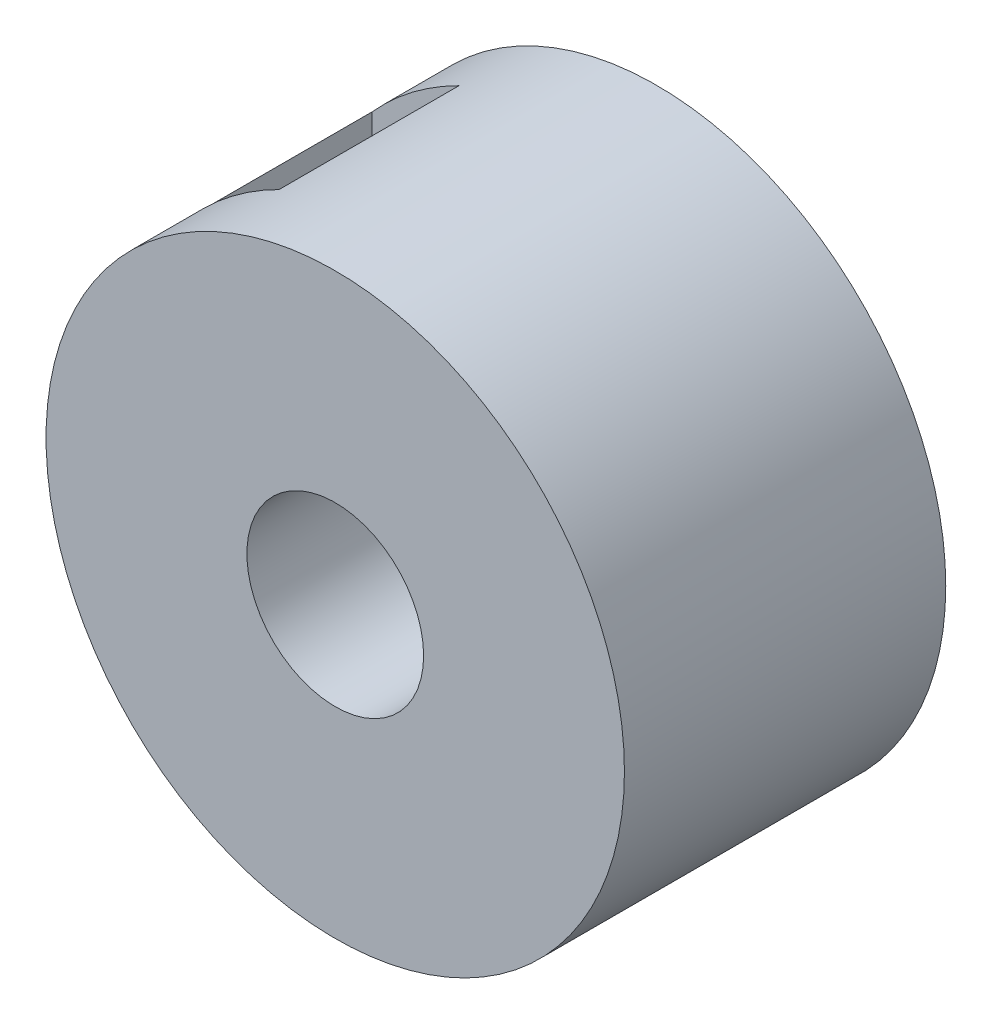
ISO-10303-21;
HEADER;
FILE_DESCRIPTION(('STEP AP214'),'2;1');
FILE_NAME('part.step','',(''),(''),'','','');
FILE_SCHEMA(('AUTOMOTIVE_DESIGN { 1 0 10303 214 1 1 1 1 }'));
ENDSEC;
DATA;
#1=APPLICATION_CONTEXT('core data for automotive mechanical design processes');
#2=APPLICATION_PROTOCOL_DEFINITION('international standard','automotive_design',2000,#1);
#3=PRODUCT_CONTEXT('',#1,'mechanical');
#4=PRODUCT('Part','Part','',(#3));
#5=PRODUCT_RELATED_PRODUCT_CATEGORY('part','',(#4));
#6=PRODUCT_DEFINITION_FORMATION('','',#4);
#7=PRODUCT_DEFINITION_CONTEXT('part definition',#1,'design');
#8=PRODUCT_DEFINITION('design','',#6,#7);
#9=PRODUCT_DEFINITION_SHAPE('','',#8);
#10=(LENGTH_UNIT() NAMED_UNIT(*) SI_UNIT(.MILLI.,.METRE.));
#11=(NAMED_UNIT(*) PLANE_ANGLE_UNIT() SI_UNIT($,.RADIAN.));
#12=(NAMED_UNIT(*) SI_UNIT($,.STERADIAN.) SOLID_ANGLE_UNIT());
#13=UNCERTAINTY_MEASURE_WITH_UNIT(LENGTH_MEASURE(1.E-05),#10,'distance_accuracy_value','');
#14=(GEOMETRIC_REPRESENTATION_CONTEXT(3) GLOBAL_UNCERTAINTY_ASSIGNED_CONTEXT((#13)) GLOBAL_UNIT_ASSIGNED_CONTEXT((#10,
#11,#12)) REPRESENTATION_CONTEXT('',''));
#15=CARTESIAN_POINT('',(0.,0.,0.));
#16=DIRECTION('',(0.,0.,1.));
#17=DIRECTION('',(1.,0.,0.));
#18=AXIS2_PLACEMENT_3D('',#15,#16,#17);
#19=CARTESIAN_POINT('',(-12.5233996659517,0.,9.99999966472387));
#20=DIRECTION('',(1.,0.,0.));
#21=DIRECTION('',(0.,0.,-1.));
#22=AXIS2_PLACEMENT_3D('',#19,#20,#21);
#23=CYLINDRICAL_SURFACE('',#22,1.6);
#24=CARTESIAN_POINT('',(-6.7,0.,9.99999966472387));
#25=DIRECTION('',(1.,0.,0.));
#26=DIRECTION('',(0.,0.,-1.));
#27=AXIS2_PLACEMENT_3D('',#24,#25,#26);
#28=CIRCLE('',#27,1.6);
#29=CARTESIAN_POINT('',(-6.7,0.,8.39999966472387));
#30=VERTEX_POINT('',#29);
#31=EDGE_CURVE('E99',#30,#30,#28,.T.);
#32=CARTESIAN_POINT('',(-8.55,0.,9.99999966472387));
#33=DIRECTION('',(-1.,0.,0.));
#34=DIRECTION('',(0.,0.,1.));
#35=AXIS2_PLACEMENT_3D('',#32,#33,#34);
#36=CIRCLE('',#35,1.6);
#37=CARTESIAN_POINT('',(-8.55,0.,8.39999966472387));
#38=VERTEX_POINT('',#37);
#39=EDGE_CURVE('E134',#38,#38,#36,.F.);
#40=CARTESIAN_POINT('',(-6.7,0.,8.39999966472387));
#41=CARTESIAN_POINT('',(-6.71927083333333,0.,8.39999966472387));
#42=CARTESIAN_POINT('',(-6.73854166666667,0.,8.39999966472387));
#43=CARTESIAN_POINT('',(-6.77708333333333,0.,8.39999966472387));
#44=CARTESIAN_POINT('',(-6.79635416666667,0.,8.39999966472387));
#45=CARTESIAN_POINT('',(-6.83489583333333,0.,8.39999966472387));
#46=CARTESIAN_POINT('',(-6.85416666666667,0.,8.39999966472387));
#47=CARTESIAN_POINT('',(-6.89270833333333,0.,8.39999966472387));
#48=CARTESIAN_POINT('',(-6.91197916666667,0.,8.39999966472387));
#49=CARTESIAN_POINT('',(-6.95052083333333,0.,8.39999966472387));
#50=CARTESIAN_POINT('',(-6.96979166666667,0.,8.39999966472387));
#51=CARTESIAN_POINT('',(-7.00833333333333,0.,8.39999966472387));
#52=CARTESIAN_POINT('',(-7.02760416666667,0.,8.39999966472387));
#53=CARTESIAN_POINT('',(-7.06614583333333,0.,8.39999966472387));
#54=CARTESIAN_POINT('',(-7.08541666666667,0.,8.39999966472387));
#55=CARTESIAN_POINT('',(-7.12395833333333,0.,8.39999966472387));
#56=CARTESIAN_POINT('',(-7.14322916666667,0.,8.39999966472387));
#57=CARTESIAN_POINT('',(-7.18177083333333,0.,8.39999966472387));
#58=CARTESIAN_POINT('',(-7.20104166666667,0.,8.39999966472387));
#59=CARTESIAN_POINT('',(-7.23958333333333,0.,8.39999966472387));
#60=CARTESIAN_POINT('',(-7.25885416666667,0.,8.39999966472387));
#61=CARTESIAN_POINT('',(-7.29739583333333,0.,8.39999966472387));
#62=CARTESIAN_POINT('',(-7.31666666666667,0.,8.39999966472387));
#63=CARTESIAN_POINT('',(-7.35520833333333,0.,8.39999966472387));
#64=CARTESIAN_POINT('',(-7.37447916666667,0.,8.39999966472387));
#65=CARTESIAN_POINT('',(-7.41302083333333,0.,8.39999966472387));
#66=CARTESIAN_POINT('',(-7.43229166666667,0.,8.39999966472387));
#67=CARTESIAN_POINT('',(-7.47083333333333,0.,8.39999966472387));
#68=CARTESIAN_POINT('',(-7.49010416666667,0.,8.39999966472387));
#69=CARTESIAN_POINT('',(-7.52864583333333,0.,8.39999966472387));
#70=CARTESIAN_POINT('',(-7.54791666666667,0.,8.39999966472387));
#71=CARTESIAN_POINT('',(-7.58645833333333,0.,8.39999966472387));
#72=CARTESIAN_POINT('',(-7.60572916666667,0.,8.39999966472387));
#73=CARTESIAN_POINT('',(-7.64427083333333,0.,8.39999966472387));
#74=CARTESIAN_POINT('',(-7.66354166666667,0.,8.39999966472387));
#75=CARTESIAN_POINT('',(-7.70208333333333,0.,8.39999966472387));
#76=CARTESIAN_POINT('',(-7.72135416666667,0.,8.39999966472387));
#77=CARTESIAN_POINT('',(-7.75989583333333,0.,8.39999966472387));
#78=CARTESIAN_POINT('',(-7.77916666666667,0.,8.39999966472387));
#79=CARTESIAN_POINT('',(-7.81770833333333,0.,8.39999966472387));
#80=CARTESIAN_POINT('',(-7.83697916666667,0.,8.39999966472387));
#81=CARTESIAN_POINT('',(-7.87552083333333,0.,8.39999966472387));
#82=CARTESIAN_POINT('',(-7.89479166666667,0.,8.39999966472387));
#83=CARTESIAN_POINT('',(-7.93333333333333,0.,8.39999966472387));
#84=CARTESIAN_POINT('',(-7.95260416666667,0.,8.39999966472387));
#85=CARTESIAN_POINT('',(-7.99114583333333,0.,8.39999966472387));
#86=CARTESIAN_POINT('',(-8.01041666666667,0.,8.39999966472387));
#87=CARTESIAN_POINT('',(-8.04895833333333,0.,8.39999966472387));
#88=CARTESIAN_POINT('',(-8.06822916666667,0.,8.39999966472387));
#89=CARTESIAN_POINT('',(-8.10677083333333,0.,8.39999966472387));
#90=CARTESIAN_POINT('',(-8.12604166666667,0.,8.39999966472387));
#91=CARTESIAN_POINT('',(-8.16458333333333,0.,8.39999966472387));
#92=CARTESIAN_POINT('',(-8.18385416666667,0.,8.39999966472387));
#93=CARTESIAN_POINT('',(-8.22239583333333,0.,8.39999966472387));
#94=CARTESIAN_POINT('',(-8.24166666666667,0.,8.39999966472387));
#95=CARTESIAN_POINT('',(-8.28020833333333,0.,8.39999966472387));
#96=CARTESIAN_POINT('',(-8.29947916666666,0.,8.39999966472387));
#97=CARTESIAN_POINT('',(-8.33802083333333,0.,8.39999966472387));
#98=CARTESIAN_POINT('',(-8.35729166666666,0.,8.39999966472387));
#99=CARTESIAN_POINT('',(-8.39583333333333,0.,8.39999966472387));
#100=CARTESIAN_POINT('',(-8.41510416666666,0.,8.39999966472387));
#101=CARTESIAN_POINT('',(-8.45364583333333,0.,8.39999966472387));
#102=CARTESIAN_POINT('',(-8.47291666666666,0.,8.39999966472387));
#103=CARTESIAN_POINT('',(-8.51145833333333,0.,8.39999966472387));
#104=CARTESIAN_POINT('',(-8.53072916666667,0.,8.39999966472387));
#105=CARTESIAN_POINT('',(-8.55,0.,8.39999966472387));
#106=B_SPLINE_CURVE_WITH_KNOTS('',3,(#40,#41,#42,#43,#44,#45,#46,#47,#48,#49,#50,#51,#52,#53,
#54,#55,#56,#57,#58,#59,#60,#61,#62,#63,#64,#65,#66,#67,#68,#69,#70,#71,#72,#73,#74,#75,#76,#77,
#78,#79,#80,#81,#82,#83,#84,#85,#86,#87,#88,#89,#90,#91,#92,#93,#94,#95,#96,#97,#98,#99,#100,
#101,#102,#103,#104,#105),.UNSPECIFIED.,.F.,.F.,(4,2,2,2,2,2,2,2,2,2,2,2,2,2,2,2,2,2,2,2,2,2,2,
2,2,2,2,2,2,2,2,2,4),(0.,0.0578124999999997,0.115624999999999,0.1734375,0.23125,
0.289062499999999,0.346875,0.4046875,0.462499999999999,0.520312499999999,0.578124999999999,
0.635937499999999,0.693749999999999,0.751562499999999,0.809374999999999,0.867187499999999,
0.924999999999999,0.982812499999998,1.040625,1.0984375,1.15625,1.2140625,1.271875,1.3296875,
1.3875,1.4453125,1.503125,1.5609375,1.61875,1.6765625,1.734375,1.7921875,1.85),.UNSPECIFIED.);
#107=EDGE_CURVE('BSEAM34',#30,#38,#106,.T.);
#108=ORIENTED_EDGE('',*,*,#31,.T.);
#109=ORIENTED_EDGE('',*,*,#39,.F.);
#110=ORIENTED_EDGE('',*,*,#107,.T.);
#111=ORIENTED_EDGE('',*,*,#107,.F.);
#112=EDGE_LOOP('',(#108,#110,#109,#111));
#113=FACE_BOUND('',#112,.T.);
#114=ADVANCED_FACE('F34',(#113),#23,.F.);
#115=CARTESIAN_POINT('',(0.,0.,-20.4558442344744));
#116=DIRECTION('',(0.,0.,1.));
#117=DIRECTION('',(1.,0.,0.));
#118=AXIS2_PLACEMENT_3D('',#115,#116,#117);
#119=CYLINDRICAL_SURFACE('',#118,9.);
#120=CARTESIAN_POINT('',(-9.,0.,12.7499996647239));
#121=CARTESIAN_POINT('',(-8.99999893245936,0.150732094383244,12.7499981983165));
#122=CARTESIAN_POINT('',(-8.99617730706269,0.301479092927,12.7375658692782));
#123=CARTESIAN_POINT('',(-8.98130590481736,0.598575006536847,12.688288473409));
#124=CARTESIAN_POINT('',(-8.97025420178754,0.744922738714214,12.6514369009592));
#125=CARTESIAN_POINT('',(-8.94213200467288,1.02889246681853,12.5546722671474));
#126=CARTESIAN_POINT('',(-8.92507058656823,1.16652725345855,12.4947939687202));
#127=CARTESIAN_POINT('',(-8.88669712370446,1.42980304986473,12.3538205196455));
#128=CARTESIAN_POINT('',(-8.86538446701522,1.5554423291241,12.2727223140459));
#129=CARTESIAN_POINT('',(-8.82006981807301,1.7948886815975,12.0890768650394));
#130=CARTESIAN_POINT('',(-8.79601116938576,1.90828973267437,11.9860142524148));
#131=CARTESIAN_POINT('',(-8.74824972808289,2.11649716491155,11.7624634924739));
#132=CARTESIAN_POINT('',(-8.72454699877658,2.21130027330405,11.6419722846351));
#133=CARTESIAN_POINT('',(-8.6795779558473,2.38178581823689,11.3835142152972));
#134=CARTESIAN_POINT('',(-8.658381838066,2.45696755854626,11.2452037158203));
#135=CARTESIAN_POINT('',(-8.62167505843869,2.58283736596423,10.9571503377272));
#136=CARTESIAN_POINT('',(-8.60616297362894,2.63353156439558,10.8074103317774));
#137=CARTESIAN_POINT('',(-8.58317198413569,2.70751366305417,10.5053177726362));
#138=CARTESIAN_POINT('',(-8.575473616912,2.73155215494405,10.3531661963228));
#139=CARTESIAN_POINT('',(-8.56832938547418,2.75388480203957,10.0468098790786));
#140=CARTESIAN_POINT('',(-8.56888143701378,2.75218545921505,9.89260566652552));
#141=CARTESIAN_POINT('',(-8.57798150913322,2.7236791338439,9.59267111233976));
#142=CARTESIAN_POINT('',(-8.58622811981501,2.69781854133944,9.44684015352559));
#143=CARTESIAN_POINT('',(-8.60929961263038,2.62325522727671,9.16169449786718));
#144=CARTESIAN_POINT('',(-8.62412516588299,2.57455017532244,9.02238046741901));
#145=CARTESIAN_POINT('',(-8.65892040636349,2.45499611619024,8.7519350245088));
#146=CARTESIAN_POINT('',(-8.67895969673658,2.38384448176113,8.62094673094464));
#147=CARTESIAN_POINT('',(-8.7218917222245,2.22162725198069,8.37245483434441));
#148=CARTESIAN_POINT('',(-8.74478517030468,2.13055667659752,8.25495461474989));
#149=CARTESIAN_POINT('',(-8.79206258069755,1.92641124977821,8.03141413099756));
#150=CARTESIAN_POINT('',(-8.8164681053405,1.81255281332942,7.92609275706142));
#151=CARTESIAN_POINT('',(-8.86314096649346,1.56848594209703,7.73586819837682));
#152=CARTESIAN_POINT('',(-8.88540815813406,1.43827640092345,7.65096639644367));
#153=CARTESIAN_POINT('',(-8.92551194390399,1.1638622812981,7.5035324033556));
#154=CARTESIAN_POINT('',(-8.94331562734555,1.01956405600497,7.44116495992596));
#155=CARTESIAN_POINT('',(-8.9722490818792,0.721855243529071,7.34179892464794));
#156=CARTESIAN_POINT('',(-8.98338078675626,0.56844731085653,7.30479298165677));
#157=CARTESIAN_POINT('',(-8.99740784277959,0.2629811141946,7.25840944691507));
#158=CARTESIAN_POINT('',(-9.00059336328466,0.11108382469676,7.24805803916311));
#159=CARTESIAN_POINT('',(-8.99922345680051,-0.192290019314816,7.25254081788383));
#160=CARTESIAN_POINT('',(-8.99466910577635,-0.343766629377612,7.26737150364536));
#161=CARTESIAN_POINT('',(-8.97852146739649,-0.638288264909713,7.32101249992359));
#162=CARTESIAN_POINT('',(-8.96709666869246,-0.781447879799152,7.35924919882028));
#163=CARTESIAN_POINT('',(-8.93853661982543,-1.05928473094201,7.45792238337304));
#164=CARTESIAN_POINT('',(-8.92140067443833,-1.19396093212591,7.51836157185393));
#165=CARTESIAN_POINT('',(-8.88268238228463,-1.45455502141013,7.66132910722377));
#166=CARTESIAN_POINT('',(-8.86100429812044,-1.58018976298334,7.74434692795634));
#167=CARTESIAN_POINT('',(-8.81568626913578,-1.81607444992139,7.9295237161647));
#168=CARTESIAN_POINT('',(-8.79204581555462,-1.92632038561877,8.03168765612038));
#169=CARTESIAN_POINT('',(-8.7443462936598,-2.13261647839858,8.25683446134768));
#170=CARTESIAN_POINT('',(-8.72030513809504,-2.22797320358393,8.38045790350791));
#171=CARTESIAN_POINT('',(-8.67546813822459,-2.3966426855674,8.64247443340888));
#172=CARTESIAN_POINT('',(-8.65467222259465,-2.46995592687254,8.78086719643522));
#173=CARTESIAN_POINT('',(-8.61891634694994,-2.59197431563521,9.06811777522072));
#174=CARTESIAN_POINT('',(-8.60393114735008,-2.64078616671214,9.2169269398796));
#175=CARTESIAN_POINT('',(-8.58159540779338,-2.71250039411907,9.52119957061985));
#176=CARTESIAN_POINT('',(-8.57424212601462,-2.7354120755372,9.67666062604723));
#177=CARTESIAN_POINT('',(-8.56827980578256,-2.75402711718725,9.98260055606583));
#178=CARTESIAN_POINT('',(-8.56930645948381,-2.75086398785782,10.1330042417674));
#179=CARTESIAN_POINT('',(-8.57910842739003,-2.72013837625648,10.431028005173));
#180=CARTESIAN_POINT('',(-8.58788340928386,-2.69257694038167,10.5786482019782));
#181=CARTESIAN_POINT('',(-8.61194440210273,-2.61458088665956,10.8649852574071));
#182=CARTESIAN_POINT('',(-8.62714178162794,-2.5644570462885,11.0037947731395));
#183=CARTESIAN_POINT('',(-8.66231608002941,-2.44300207573848,11.2711448072469));
#184=CARTESIAN_POINT('',(-8.68229393943823,-2.37166677165226,11.399683298209));
#185=CARTESIAN_POINT('',(-8.72571614166417,-2.20667281830586,11.6480753519819));
#186=CARTESIAN_POINT('',(-8.74926262367163,-2.11227528824507,11.7674202340936));
#187=CARTESIAN_POINT('',(-8.79668470464009,-1.90515328521005,11.9889427174175));
#188=CARTESIAN_POINT('',(-8.82056038861478,-1.79242399389637,12.0911157907768));
#189=CARTESIAN_POINT('',(-8.86683031610179,-1.547669239036,12.2785286654089));
#190=CARTESIAN_POINT('',(-8.88915651654838,-1.41515737636223,12.3631518437793));
#191=CARTESIAN_POINT('',(-8.92897904862101,-1.13710535194912,12.508803456823));
#192=CARTESIAN_POINT('',(-8.94647748145661,-0.991570894729586,12.5698421609133));
#193=CARTESIAN_POINT('',(-8.97328009657381,-0.706221718726763,12.6615750248649));
#194=CARTESIAN_POINT('',(-8.9832154245542,-0.567225966118484,12.6946419401547));
#195=CARTESIAN_POINT('',(-8.99657528918104,-0.285490807433529,12.7388529590984));
#196=CARTESIAN_POINT('',(-9.00000101102327,-0.142752087632907,12.7500010534972));
#197=CARTESIAN_POINT('',(-9.,0.,12.7499996647239));
#198=B_SPLINE_CURVE_WITH_KNOTS('',3,(#120,#121,#122,#123,#124,#125,#126,#127,#128,#129,#130,
#131,#132,#133,#134,#135,#136,#137,#138,#139,#140,#141,#142,#143,#144,#145,#146,#147,#148,#149,
#150,#151,#152,#153,#154,#155,#156,#157,#158,#159,#160,#161,#162,#163,#164,#165,#166,#167,#168,
#169,#170,#171,#172,#173,#174,#175,#176,#177,#178,#179,#180,#181,#182,#183,#184,#185,#186,#187,
#188,#189,#190,#191,#192,#193,#194,#195,#196,#197),.UNSPECIFIED.,.T.,.F.,(4,2,2,2,2,2,2,2,2,2,2,
2,2,2,2,2,2,2,2,2,2,2,2,2,2,2,2,2,2,2,2,2,2,2,2,2,2,2,4),(0.,0.451671768738212,
0.903463917390862,1.3545766662571,1.80575439593737,2.26899159301454,2.73231023514845,
3.20649731690051,3.68056560751205,4.14091608625177,4.60115027179782,5.04408074028462,
5.48705640257287,5.93627973927626,6.38561551714736,6.85445681262312,7.3233298491407,
7.79556456434792,8.26766234228229,8.72225023467786,9.17677493730695,9.62058331100847,
10.0644457297312,10.518825583913,10.973323610017,11.444987693106,11.9166414084481,
12.3862228519221,12.8556355363944,13.3047534112771,13.7538520252794,14.1969455015462,
14.6401262257455,15.0999803202335,15.5599554792002,16.0340612766837,16.5079604004188,
16.9357978208538,17.3635573380027),.UNSPECIFIED.);
#199=CARTESIAN_POINT('',(-9.,0.,12.7499996647239));
#200=VERTEX_POINT('',#199);
#201=EDGE_CURVE('E12',#200,#200,#198,.T.);
#202=ORIENTED_EDGE('',*,*,#201,.F.);
#203=EDGE_LOOP('',(#202));
#204=FACE_BOUND('',#203,.T.);
#205=CARTESIAN_POINT('',(0.,0.,4.99999988824129));
#206=DIRECTION('',(0.,0.,1.));
#207=DIRECTION('',(1.,0.,0.));
#208=AXIS2_PLACEMENT_3D('',#205,#206,#207);
#209=CIRCLE('',#208,9.);
#210=CARTESIAN_POINT('',(9.,0.,4.99999988824129));
#211=VERTEX_POINT('',#210);
#212=EDGE_CURVE('E119',#211,#211,#209,.T.);
#213=ORIENTED_EDGE('',*,*,#212,.T.);
#214=EDGE_LOOP('',(#213));
#215=FACE_BOUND('',#214,.T.);
#216=CARTESIAN_POINT('',(0.,0.,14.9999996647239));
#217=DIRECTION('',(0.,0.,1.));
#218=DIRECTION('',(1.,0.,0.));
#219=AXIS2_PLACEMENT_3D('',#216,#217,#218);
#220=CIRCLE('',#219,9.);
#221=CARTESIAN_POINT('',(9.,0.,14.9999996647239));
#222=VERTEX_POINT('',#221);
#223=EDGE_CURVE('E115',#222,#222,#220,.T.);
#224=ORIENTED_EDGE('',*,*,#223,.F.);
#225=EDGE_LOOP('',(#224));
#226=FACE_BOUND('',#225,.T.);
#227=CARTESIAN_POINT('',(0.,0.,12.7499996647239));
#228=DIRECTION('',(0.,0.,-1.));
#229=DIRECTION('',(-1.,0.,0.));
#230=AXIS2_PLACEMENT_3D('',#227,#228,#229);
#231=CIRCLE('',#230,9.);
#232=CARTESIAN_POINT('',(-4.,8.06225774829855,12.7499996647239));
#233=VERTEX_POINT('',#232);
#234=CARTESIAN_POINT('',(-6.7,6.00915967502944,12.7499996647239));
#235=VERTEX_POINT('',#234);
#236=EDGE_CURVE('E128',#233,#235,#231,.F.);
#237=ORIENTED_EDGE('',*,*,#236,.T.);
#238=DIRECTION('',(0.,0.,1.));
#239=VECTOR('',#238,1.);
#240=CARTESIAN_POINT('',(-6.7,6.00915967502944,-20.4558442344744));
#241=LINE('',#240,#239);
#242=CARTESIAN_POINT('',(-6.7,6.00915967502944,7.14999966472387));
#243=VERTEX_POINT('',#242);
#244=EDGE_CURVE('E43',#235,#243,#241,.F.);
#245=ORIENTED_EDGE('',*,*,#244,.T.);
#246=CARTESIAN_POINT('',(0.,0.,7.14999966472387));
#247=DIRECTION('',(0.,0.,1.));
#248=DIRECTION('',(1.,0.,0.));
#249=AXIS2_PLACEMENT_3D('',#246,#247,#248);
#250=CIRCLE('',#249,9.);
#251=CARTESIAN_POINT('',(-4.,8.06225774829855,7.14999966472387));
#252=VERTEX_POINT('',#251);
#253=EDGE_CURVE('E118',#243,#252,#250,.F.);
#254=ORIENTED_EDGE('',*,*,#253,.T.);
#255=DIRECTION('',(0.,0.,1.));
#256=VECTOR('',#255,1.);
#257=CARTESIAN_POINT('',(-4.,8.06225774829855,-20.4558442344744));
#258=LINE('',#257,#256);
#259=EDGE_CURVE('E125',#252,#233,#258,.T.);
#260=ORIENTED_EDGE('',*,*,#259,.T.);
#261=EDGE_LOOP('',(#237,#245,#254,#260));
#262=FACE_BOUND('',#261,.T.);
#263=ADVANCED_FACE('F139',(#204,#215,#226,#262),#119,.T.);
#264=CARTESIAN_POINT('',(0.,0.,14.9999996647239));
#265=DIRECTION('',(0.,0.,-1.));
#266=DIRECTION('',(-1.,0.,0.));
#267=AXIS2_PLACEMENT_3D('',#264,#265,#266);
#268=PLANE('',#267);
#269=CARTESIAN_POINT('',(0.,0.,14.9999996647239));
#270=DIRECTION('',(0.,0.,1.));
#271=DIRECTION('',(1.,0.,0.));
#272=AXIS2_PLACEMENT_3D('',#269,#270,#271);
#273=CIRCLE('',#272,2.75);
#274=CARTESIAN_POINT('',(2.75,0.,14.9999996647239));
#275=VERTEX_POINT('',#274);
#276=EDGE_CURVE('E82',#275,#275,#273,.T.);
#277=ORIENTED_EDGE('',*,*,#276,.F.);
#278=EDGE_LOOP('',(#277));
#279=FACE_BOUND('',#278,.T.);
#280=ORIENTED_EDGE('',*,*,#223,.T.);
#281=EDGE_LOOP('',(#280));
#282=FACE_BOUND('',#281,.T.);
#283=ADVANCED_FACE('F36',(#279,#282),#268,.F.);
#284=CARTESIAN_POINT('',(0.,0.,-7.77817459305202));
#285=DIRECTION('',(0.,0.,1.));
#286=DIRECTION('',(1.,0.,0.));
#287=AXIS2_PLACEMENT_3D('',#284,#285,#286);
#288=CYLINDRICAL_SURFACE('',#287,2.75);
#289=CARTESIAN_POINT('',(0.,0.,4.99999988824129));
#290=DIRECTION('',(0.,0.,1.));
#291=DIRECTION('',(1.,0.,0.));
#292=AXIS2_PLACEMENT_3D('',#289,#290,#291);
#293=CIRCLE('',#292,2.75);
#294=CARTESIAN_POINT('',(2.75,0.,4.99999988824129));
#295=VERTEX_POINT('',#294);
#296=EDGE_CURVE('E38',#295,#295,#293,.F.);
#297=ORIENTED_EDGE('',*,*,#296,.T.);
#298=EDGE_LOOP('',(#297));
#299=FACE_BOUND('',#298,.T.);
#300=CARTESIAN_POINT('',(-2.75,0.,8.39999966472387));
#301=CARTESIAN_POINT('',(-2.74999415856361,-0.0822498365114415,8.40000630351436));
#302=CARTESIAN_POINT('',(-2.74626880850395,-0.164637551931881,8.40638661538434));
#303=CARTESIAN_POINT('',(-2.73171596023133,-0.326975171682539,8.43160115509162));
#304=CARTESIAN_POINT('',(-2.72086840482153,-0.406917522112721,8.45047055528636));
#305=CARTESIAN_POINT('',(-2.69317782898008,-0.561639924054727,8.49962768676964));
#306=CARTESIAN_POINT('',(-2.67636440699553,-0.6364433228631,8.52985909083053));
#307=CARTESIAN_POINT('',(-2.63819563364609,-0.779696348421332,8.60054994969496));
#308=CARTESIAN_POINT('',(-2.61684187157108,-0.848148186444534,8.64100582648052));
#309=CARTESIAN_POINT('',(-2.56956515598009,-0.982482219295087,8.73433610193841));
#310=CARTESIAN_POINT('',(-2.54342123172293,-1.04780136138511,8.78790694916455));
#311=CARTESIAN_POINT('',(-2.49001162088758,-1.16907791962007,8.90439953330003));
#312=CARTESIAN_POINT('',(-2.46274457993971,-1.22502359449848,8.96733281419589));
#313=CARTESIAN_POINT('',(-2.40650999288773,-1.33239721646435,9.10920845453924));
#314=CARTESIAN_POINT('',(-2.37770134009969,-1.38258924234577,9.1891573662594));
#315=CARTESIAN_POINT('',(-2.32555569276352,-1.46861633396013,9.35804230118198));
#316=CARTESIAN_POINT('',(-2.30221017985544,-1.50447381341246,9.44696401949842));
#317=CARTESIAN_POINT('',(-2.26921935287564,-1.55364464330888,9.61048769037535));
#318=CARTESIAN_POINT('',(-2.25766221833803,-1.57023762890952,9.68371676189729));
#319=CARTESIAN_POINT('',(-2.24167504077814,-1.59298291503049,9.83251007827228));
#320=CARTESIAN_POINT('',(-2.23723693831975,-1.59914702248784,9.90807158362519));
#321=CARTESIAN_POINT('',(-2.23613459154646,-1.60068846665753,10.0594799588034));
#322=CARTESIAN_POINT('',(-2.23948251261393,-1.59604892303827,10.1353270900842));
#323=CARTESIAN_POINT('',(-2.25347188017967,-1.57623114250868,10.2849569009596));
#324=CARTESIAN_POINT('',(-2.26411851790469,-1.5610454044963,10.358738072234));
#325=CARTESIAN_POINT('',(-2.29117658691866,-1.52104587433082,10.5019084095639));
#326=CARTESIAN_POINT('',(-2.30754777485793,-1.49629917116168,10.5713243445526));
#327=CARTESIAN_POINT('',(-2.34428803119403,-1.43805316579433,10.7052236003673));
#328=CARTESIAN_POINT('',(-2.3646586060272,-1.40455056396002,10.7697050497777));
#329=CARTESIAN_POINT('',(-2.41118450971479,-1.32333730176393,10.9032469782609));
#330=CARTESIAN_POINT('',(-2.43773914250753,-1.27419247060592,10.9712970679805));
#331=CARTESIAN_POINT('',(-2.49131107379367,-1.16598456840969,11.0988558863787));
#332=CARTESIAN_POINT('',(-2.51832876550051,-1.10691265047436,11.1583569077113));
#333=CARTESIAN_POINT('',(-2.57369892772663,-0.971866634775642,11.274496958754));
#334=CARTESIAN_POINT('',(-2.60180841243088,-0.894707982589216,11.329889003797));
#335=CARTESIAN_POINT('',(-2.65260456069497,-0.730451803069289,11.4267125260964));
#336=CARTESIAN_POINT('',(-2.67529449051113,-0.643360309063389,11.4681524182338));
#337=CARTESIAN_POINT('',(-2.71131869541478,-0.467692320754626,11.5327809752498));
#338=CARTESIAN_POINT('',(-2.72518029291844,-0.379611186304039,11.55701117179));
#339=CARTESIAN_POINT('',(-2.74422270315645,-0.1997254437036,11.5901089237394));
#340=CARTESIAN_POINT('',(-2.74941271266131,-0.107924886246215,11.598992755284));
#341=CARTESIAN_POINT('',(-2.75042525150448,0.064203681806393,11.6007283877013));
#342=CARTESIAN_POINT('',(-2.74734992914762,0.144513641925788,11.5954664452206));
#343=CARTESIAN_POINT('',(-2.73442208496982,0.302896221182561,11.5731010805152));
#344=CARTESIAN_POINT('',(-2.72456952793325,0.380968828692086,11.5559975967598));
#345=CARTESIAN_POINT('',(-2.69918634960242,0.531650056332373,11.511105899964));
#346=CARTESIAN_POINT('',(-2.68374329520434,0.604323163463161,11.4834821418888));
#347=CARTESIAN_POINT('',(-2.64841814607047,0.74402930067272,11.4185760489477));
#348=CARTESIAN_POINT('',(-2.62853505689191,0.811061062610962,11.3812915500475));
#349=CARTESIAN_POINT('',(-2.58355369375871,0.945122238072814,11.293756110822));
#350=CARTESIAN_POINT('',(-2.55812777567618,1.01142222401688,11.2425583777605));
#351=CARTESIAN_POINT('',(-2.50574992841985,1.13500332209058,11.1308051033997));
#352=CARTESIAN_POINT('',(-2.47879625118495,1.19227380743337,11.0702386997151));
#353=CARTESIAN_POINT('',(-2.42254005530773,1.30311183558067,10.9330450480246));
#354=CARTESIAN_POINT('',(-2.39333771903953,1.35543624573777,10.8553650659588));
#355=CARTESIAN_POINT('',(-2.33960317166277,1.44621871288237,10.6908326833856));
#356=CARTESIAN_POINT('',(-2.31506515661462,1.48469405664546,10.6039918940474));
#357=CARTESIAN_POINT('',(-2.27893979461191,1.53940553066292,10.4425467962071));
#358=CARTESIAN_POINT('',(-2.2657016691443,1.55864612427996,10.3693327350673));
#359=CARTESIAN_POINT('',(-2.24621290245038,1.58660853582185,10.2200503050645));
#360=CARTESIAN_POINT('',(-2.239953662278,1.5953432994212,10.1439855683984));
#361=CARTESIAN_POINT('',(-2.23533465398131,1.60181082612373,9.99094163120784));
#362=CARTESIAN_POINT('',(-2.23699536506617,1.59951506666523,9.91396057394294));
#363=CARTESIAN_POINT('',(-2.24800474374154,1.58400091669501,9.76165319514712));
#364=CARTESIAN_POINT('',(-2.2573581252579,1.57077582886951,9.68632791731333));
#365=CARTESIAN_POINT('',(-2.28206734059213,1.53464159274365,9.54141070013758));
#366=CARTESIAN_POINT('',(-2.29724924973334,1.51201160717549,9.47171762921502));
#367=CARTESIAN_POINT('',(-2.33191739563101,1.4579742806447,9.33698667756883));
#368=CARTESIAN_POINT('',(-2.35140526602915,1.42656360716817,9.27195057608895));
#369=CARTESIAN_POINT('',(-2.39615791553675,1.35024800903041,9.13762719401303));
#370=CARTESIAN_POINT('',(-2.42184994305474,1.30400645542773,9.06924204084586));
#371=CARTESIAN_POINT('',(-2.47416584406052,1.20179270313138,8.94053855951803));
#372=CARTESIAN_POINT('',(-2.50079042977454,1.14581293164833,8.88022657441184));
#373=CARTESIAN_POINT('',(-2.55631290295189,1.01654356353565,8.76088716303398));
#374=CARTESIAN_POINT('',(-2.58501698012438,0.94193111186451,8.70318730876119));
#375=CARTESIAN_POINT('',(-2.63766706682994,0.78247352702398,8.60118062125344));
#376=CARTESIAN_POINT('',(-2.6616120021223,0.697626090527771,8.55687681061984));
#377=CARTESIAN_POINT('',(-2.70099380813628,0.524045947327082,8.48549801055562));
#378=CARTESIAN_POINT('',(-2.71678870104331,0.435704609297954,8.4576880708811));
#379=CARTESIAN_POINT('',(-2.733965178316,0.300045787120565,8.42770042006461));
#380=CARTESIAN_POINT('',(-2.73860311707218,0.254355134335916,8.41966156846039));
#381=CARTESIAN_POINT('',(-2.74559327545066,0.162286134847719,8.40757712283932));
#382=CARTESIAN_POINT('',(-2.74794740819014,0.115908396833553,8.40352818647295));
#383=CARTESIAN_POINT('',(-2.74970834912027,0.0463113139008269,8.40050133013912));
#384=CARTESIAN_POINT('',(-2.75000164491792,0.0231611235467035,8.39999779527521));
#385=CARTESIAN_POINT('',(-2.75,0.,8.39999966472387));
#386=B_SPLINE_CURVE_WITH_KNOTS('',3,(#300,#301,#302,#303,#304,#305,#306,#307,#308,#309,#310,
#311,#312,#313,#314,#315,#316,#317,#318,#319,#320,#321,#322,#323,#324,#325,#326,#327,#328,#329,
#330,#331,#332,#333,#334,#335,#336,#337,#338,#339,#340,#341,#342,#343,#344,#345,#346,#347,#348,
#349,#350,#351,#352,#353,#354,#355,#356,#357,#358,#359,#360,#361,#362,#363,#364,#365,#366,#367,
#368,#369,#370,#371,#372,#373,#374,#375,#376,#377,#378,#379,#380,#381,#382,#383,#384,#385),
.UNSPECIFIED.,.T.,.F.,(4,2,2,2,2,2,2,2,2,2,2,2,2,2,2,2,2,2,2,2,2,2,2,2,2,2,2,2,2,2,2,2,2,2,2,2,
2,2,2,2,2,2,4),(0.,0.246668758763494,0.494035170475968,0.740191099528015,0.986261006174305,
1.25050240718009,1.51507236345414,1.80970868514022,2.10388248983809,2.33081361546507,
2.55748765122631,2.78451609492962,3.01170618082451,3.23733021589697,3.46303939966942,
3.72613111812423,3.98945855627861,4.2850964695844,4.58055575575532,4.85610924029499,
5.13137029690632,5.3718035198817,5.61223799219758,5.84905873886629,6.08593258000725,
6.34751199502908,6.60939700022426,6.90231731099574,7.19487071236723,7.42444508971402,
7.6537362861965,7.88362069902913,8.11364608581824,8.33728283872047,8.56100458345859,
8.81938305281244,9.07796335216253,9.37225254983763,9.66660809966249,9.94660615461503,
10.0862897139267,10.2258561606825,10.2953167923281),.UNSPECIFIED.);
#387=CARTESIAN_POINT('',(-2.75,0.,8.39999966472387));
#388=VERTEX_POINT('',#387);
#389=EDGE_CURVE('E96',#388,#388,#386,.T.);
#390=ORIENTED_EDGE('',*,*,#389,.T.);
#391=EDGE_LOOP('',(#390));
#392=FACE_BOUND('',#391,.T.);
#393=ORIENTED_EDGE('',*,*,#276,.T.);
#394=EDGE_LOOP('',(#393));
#395=FACE_BOUND('',#394,.T.);
#396=ADVANCED_FACE('F166',(#299,#392,#395),#288,.F.);
#397=CARTESIAN_POINT('',(-6.7,12.7048995345831,12.7499996647239));
#398=DIRECTION('',(1.,0.,0.));
#399=DIRECTION('',(0.,0.,-1.));
#400=AXIS2_PLACEMENT_3D('',#397,#398,#399);
#401=PLANE('',#400);
#402=ORIENTED_EDGE('',*,*,#31,.F.);
#403=EDGE_LOOP('',(#402));
#404=FACE_BOUND('',#403,.T.);
#405=DIRECTION('',(0.,-1.,0.));
#406=VECTOR('',#405,1.);
#407=CARTESIAN_POINT('',(-6.7,12.7048995345831,12.7499996647239));
#408=LINE('',#407,#406);
#409=CARTESIAN_POINT('',(-6.7,-3.3,12.7499996647239));
#410=VERTEX_POINT('',#409);
#411=EDGE_CURVE('E74',#235,#410,#408,.T.);
#412=ORIENTED_EDGE('',*,*,#411,.T.);
#413=DIRECTION('',(0.,0.,1.));
#414=VECTOR('',#413,1.);
#415=CARTESIAN_POINT('',(-6.7,-3.3,12.7499996647239));
#416=LINE('',#415,#414);
#417=CARTESIAN_POINT('',(-6.7,-3.3,7.14999966472387));
#418=VERTEX_POINT('',#417);
#419=EDGE_CURVE('E78',#418,#410,#416,.T.);
#420=ORIENTED_EDGE('',*,*,#419,.F.);
#421=DIRECTION('',(0.,-1.,0.));
#422=VECTOR('',#421,1.);
#423=CARTESIAN_POINT('',(-6.7,12.7048995345831,7.14999966472387));
#424=LINE('',#423,#422);
#425=EDGE_CURVE('E109',#243,#418,#424,.T.);
#426=ORIENTED_EDGE('',*,*,#425,.F.);
#427=ORIENTED_EDGE('',*,*,#244,.F.);
#428=EDGE_LOOP('',(#412,#420,#426,#427));
#429=FACE_BOUND('',#428,.T.);
#430=ADVANCED_FACE('F76',(#404,#429),#401,.T.);
#431=CARTESIAN_POINT('',(-6.7,12.7048995345831,12.7499996647239));
#432=DIRECTION('',(0.,0.,-1.));
#433=DIRECTION('',(-1.,0.,0.));
#434=AXIS2_PLACEMENT_3D('',#431,#432,#433);
#435=PLANE('',#434);
#436=DIRECTION('',(0.,-1.,0.));
#437=VECTOR('',#436,1.);
#438=CARTESIAN_POINT('',(-4.,12.7048995345831,12.7499996647239));
#439=LINE('',#438,#437);
#440=CARTESIAN_POINT('',(-4.,-3.3,12.7499996647239));
#441=VERTEX_POINT('',#440);
#442=EDGE_CURVE('E83',#233,#441,#439,.T.);
#443=ORIENTED_EDGE('',*,*,#442,.T.);
#444=DIRECTION('',(1.,0.,0.));
#445=VECTOR('',#444,1.);
#446=CARTESIAN_POINT('',(-6.7,-3.3,12.7499996647239));
#447=LINE('',#446,#445);
#448=EDGE_CURVE('E86',#410,#441,#447,.T.);
#449=ORIENTED_EDGE('',*,*,#448,.F.);
#450=ORIENTED_EDGE('',*,*,#411,.F.);
#451=ORIENTED_EDGE('',*,*,#236,.F.);
#452=EDGE_LOOP('',(#443,#449,#450,#451));
#453=FACE_BOUND('',#452,.T.);
#454=ADVANCED_FACE('F87',(#453),#435,.T.);
#455=CARTESIAN_POINT('',(-4.,12.7048995345831,12.7499996647239));
#456=DIRECTION('',(-1.,0.,0.));
#457=DIRECTION('',(0.,0.,1.));
#458=AXIS2_PLACEMENT_3D('',#455,#456,#457);
#459=PLANE('',#458);
#460=CARTESIAN_POINT('',(-4.,0.,9.99999966472387));
#461=DIRECTION('',(-1.,0.,0.));
#462=DIRECTION('',(0.,0.,1.));
#463=AXIS2_PLACEMENT_3D('',#460,#461,#462);
#464=CIRCLE('',#463,1.6);
#465=CARTESIAN_POINT('',(-4.,0.,11.5999996647239));
#466=VERTEX_POINT('',#465);
#467=EDGE_CURVE('E131',#466,#466,#464,.T.);
#468=ORIENTED_EDGE('',*,*,#467,.F.);
#469=EDGE_LOOP('',(#468));
#470=FACE_BOUND('',#469,.T.);
#471=DIRECTION('',(0.,-1.,0.));
#472=VECTOR('',#471,1.);
#473=CARTESIAN_POINT('',(-4.,12.7048995345831,7.14999966472387));
#474=LINE('',#473,#472);
#475=CARTESIAN_POINT('',(-4.,-3.3,7.14999966472387));
#476=VERTEX_POINT('',#475);
#477=EDGE_CURVE('E50',#252,#476,#474,.T.);
#478=ORIENTED_EDGE('',*,*,#477,.T.);
#479=DIRECTION('',(0.,0.,-1.));
#480=VECTOR('',#479,1.);
#481=CARTESIAN_POINT('',(-4.,-3.3,12.7499996647239));
#482=LINE('',#481,#480);
#483=EDGE_CURVE('E92',#441,#476,#482,.T.);
#484=ORIENTED_EDGE('',*,*,#483,.F.);
#485=ORIENTED_EDGE('',*,*,#442,.F.);
#486=ORIENTED_EDGE('',*,*,#259,.F.);
#487=EDGE_LOOP('',(#478,#484,#485,#486));
#488=FACE_BOUND('',#487,.T.);
#489=ADVANCED_FACE('F159',(#470,#488),#459,.T.);
#490=CARTESIAN_POINT('',(-6.7,12.7048995345831,7.14999966472387));
#491=DIRECTION('',(0.,0.,1.));
#492=DIRECTION('',(1.,0.,0.));
#493=AXIS2_PLACEMENT_3D('',#490,#491,#492);
#494=PLANE('',#493);
#495=ORIENTED_EDGE('',*,*,#425,.T.);
#496=DIRECTION('',(-1.,0.,0.));
#497=VECTOR('',#496,1.);
#498=CARTESIAN_POINT('',(-6.7,-3.3,7.14999966472387));
#499=LINE('',#498,#497);
#500=EDGE_CURVE('E95',#476,#418,#499,.T.);
#501=ORIENTED_EDGE('',*,*,#500,.F.);
#502=ORIENTED_EDGE('',*,*,#477,.F.);
#503=ORIENTED_EDGE('',*,*,#253,.F.);
#504=EDGE_LOOP('',(#495,#501,#502,#503));
#505=FACE_BOUND('',#504,.T.);
#506=ADVANCED_FACE('F156',(#505),#494,.T.);
#507=CARTESIAN_POINT('',(0.,-3.3,0.));
#508=DIRECTION('',(0.,-1.,0.));
#509=DIRECTION('',(0.,0.,-1.));
#510=AXIS2_PLACEMENT_3D('',#507,#508,#509);
#511=PLANE('',#510);
#512=ORIENTED_EDGE('',*,*,#419,.T.);
#513=ORIENTED_EDGE('',*,*,#448,.T.);
#514=ORIENTED_EDGE('',*,*,#483,.T.);
#515=ORIENTED_EDGE('',*,*,#500,.T.);
#516=EDGE_LOOP('',(#512,#513,#514,#515));
#517=FACE_BOUND('',#516,.T.);
#518=ADVANCED_FACE('F94',(#517),#511,.F.);
#519=ORIENTED_EDGE('',*,*,#467,.T.);
#520=EDGE_LOOP('',(#519));
#521=FACE_BOUND('',#520,.T.);
#522=ORIENTED_EDGE('',*,*,#389,.F.);
#523=EDGE_LOOP('',(#522));
#524=FACE_BOUND('',#523,.T.);
#525=ADVANCED_FACE('F149',(#521,#524),#23,.F.);
#526=CARTESIAN_POINT('',(-8.55,0.,9.99999966472387));
#527=DIRECTION('',(-1.,0.,0.));
#528=DIRECTION('',(0.,0.,1.));
#529=AXIS2_PLACEMENT_3D('',#526,#527,#528);
#530=PLANE('',#529);
#531=CARTESIAN_POINT('',(-8.55,0.,9.99999966472387));
#532=DIRECTION('',(-1.,0.,0.));
#533=DIRECTION('',(0.,0.,1.));
#534=AXIS2_PLACEMENT_3D('',#531,#532,#533);
#535=CIRCLE('',#534,2.75);
#536=CARTESIAN_POINT('',(-8.55,0.,12.7499996647239));
#537=VERTEX_POINT('',#536);
#538=EDGE_CURVE('E122',#537,#537,#535,.T.);
#539=ORIENTED_EDGE('',*,*,#538,.T.);
#540=EDGE_LOOP('',(#539));
#541=FACE_BOUND('',#540,.T.);
#542=ORIENTED_EDGE('',*,*,#39,.T.);
#543=EDGE_LOOP('',(#542));
#544=FACE_BOUND('',#543,.T.);
#545=ADVANCED_FACE('F146',(#541,#544),#530,.T.);
#546=CARTESIAN_POINT('',(-8.55,0.,9.99999966472387));
#547=DIRECTION('',(-1.,0.,0.));
#548=DIRECTION('',(0.,0.,1.));
#549=AXIS2_PLACEMENT_3D('',#546,#547,#548);
#550=CYLINDRICAL_SURFACE('',#549,2.75);
#551=ORIENTED_EDGE('',*,*,#201,.T.);
#552=EDGE_LOOP('',(#551));
#553=FACE_BOUND('',#552,.T.);
#554=ORIENTED_EDGE('',*,*,#538,.F.);
#555=EDGE_LOOP('',(#554));
#556=FACE_BOUND('',#555,.T.);
#557=ADVANCED_FACE('F141',(#553,#556),#550,.F.);
#558=CARTESIAN_POINT('',(0.,0.,4.99999988824129));
#559=DIRECTION('',(0.,0.,1.));
#560=DIRECTION('',(1.,0.,0.));
#561=AXIS2_PLACEMENT_3D('',#558,#559,#560);
#562=PLANE('',#561);
#563=ORIENTED_EDGE('',*,*,#296,.F.);
#564=EDGE_LOOP('',(#563));
#565=FACE_BOUND('',#564,.T.);
#566=ORIENTED_EDGE('',*,*,#212,.F.);
#567=EDGE_LOOP('',(#566));
#568=FACE_BOUND('',#567,.T.);
#569=ADVANCED_FACE('F145',(#565,#568),#562,.F.);
#570=CLOSED_SHELL('',(#114,#263,#283,#396,#430,#454,#489,#506,#518,#525,#545,#557,#569));
#571=MANIFOLD_SOLID_BREP('B2',#570);
#572=ADVANCED_BREP_SHAPE_REPRESENTATION('',(#18,#571),#14);
#573=SHAPE_DEFINITION_REPRESENTATION(#9,#572);
ENDSEC;
END-ISO-10303-21;
